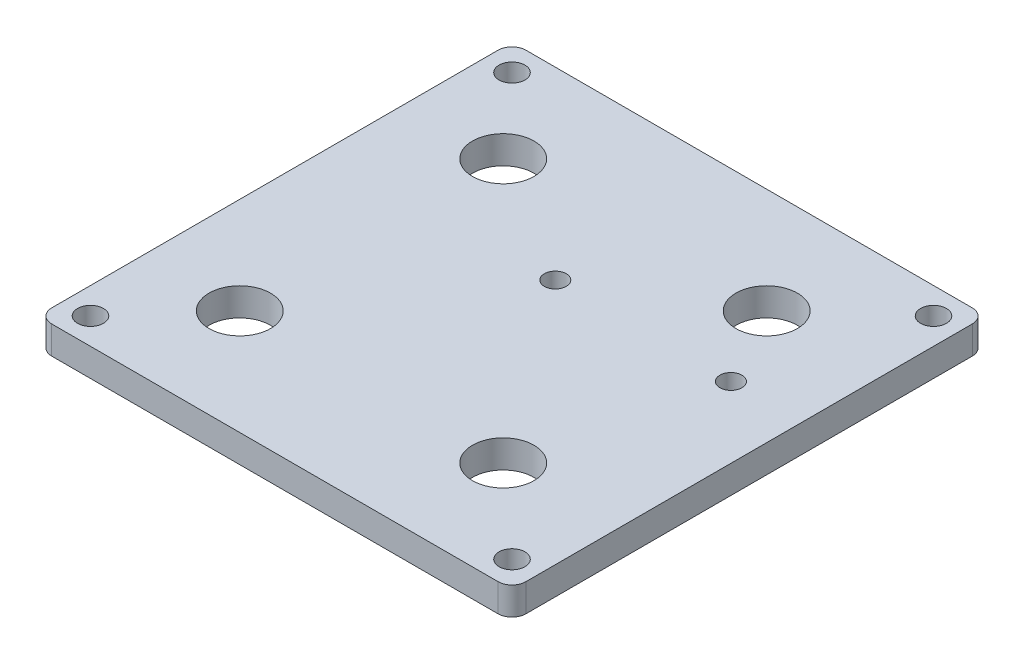
ISO-10303-21;
HEADER;
FILE_DESCRIPTION(('STEP AP214'),'2;1');
FILE_NAME('part.step','',(''),(''),'','','');
FILE_SCHEMA(('AUTOMOTIVE_DESIGN { 1 0 10303 214 1 1 1 1 }'));
ENDSEC;
DATA;
#1=APPLICATION_CONTEXT('core data for automotive mechanical design processes');
#2=APPLICATION_PROTOCOL_DEFINITION('international standard','automotive_design',2000,#1);
#3=PRODUCT_CONTEXT('',#1,'mechanical');
#4=PRODUCT('Part','Part','',(#3));
#5=PRODUCT_RELATED_PRODUCT_CATEGORY('part','',(#4));
#6=PRODUCT_DEFINITION_FORMATION('','',#4);
#7=PRODUCT_DEFINITION_CONTEXT('part definition',#1,'design');
#8=PRODUCT_DEFINITION('design','',#6,#7);
#9=PRODUCT_DEFINITION_SHAPE('','',#8);
#10=(LENGTH_UNIT() NAMED_UNIT(*) SI_UNIT(.MILLI.,.METRE.));
#11=(NAMED_UNIT(*) PLANE_ANGLE_UNIT() SI_UNIT($,.RADIAN.));
#12=(NAMED_UNIT(*) SI_UNIT($,.STERADIAN.) SOLID_ANGLE_UNIT());
#13=UNCERTAINTY_MEASURE_WITH_UNIT(LENGTH_MEASURE(1.E-05),#10,'distance_accuracy_value','');
#14=(GEOMETRIC_REPRESENTATION_CONTEXT(3) GLOBAL_UNCERTAINTY_ASSIGNED_CONTEXT((#13)) GLOBAL_UNIT_ASSIGNED_CONTEXT((#10,
#11,#12)) REPRESENTATION_CONTEXT('',''));
#15=CARTESIAN_POINT('',(0.,0.,0.));
#16=DIRECTION('',(0.,0.,1.));
#17=DIRECTION('',(1.,0.,0.));
#18=AXIS2_PLACEMENT_3D('',#15,#16,#17);
#19=CARTESIAN_POINT('',(0.,0.,0.));
#20=DIRECTION('',(0.,1.,0.));
#21=DIRECTION('',(0.,0.,1.));
#22=AXIS2_PLACEMENT_3D('',#19,#20,#21);
#23=PLANE('',#22);
#24=CARTESIAN_POINT('',(39.93,0.,16.));
#25=DIRECTION('',(0.,1.,0.));
#26=DIRECTION('',(0.,0.,1.));
#27=AXIS2_PLACEMENT_3D('',#24,#25,#26);
#28=CIRCLE('',#27,1.25);
#29=CARTESIAN_POINT('',(39.93,0.,17.25));
#30=VERTEX_POINT('',#29);
#31=EDGE_CURVE('E616',#30,#30,#28,.T.);
#32=ORIENTED_EDGE('',*,*,#31,.T.);
#33=EDGE_LOOP('',(#32));
#34=FACE_BOUND('',#33,.T.);
#35=CARTESIAN_POINT('',(19.93,0.,16.));
#36=DIRECTION('',(0.,1.,0.));
#37=DIRECTION('',(0.,0.,1.));
#38=AXIS2_PLACEMENT_3D('',#35,#36,#37);
#39=CIRCLE('',#38,1.25);
#40=CARTESIAN_POINT('',(19.93,0.,17.25));
#41=VERTEX_POINT('',#40);
#42=EDGE_CURVE('E305',#41,#41,#39,.T.);
#43=ORIENTED_EDGE('',*,*,#42,.T.);
#44=EDGE_LOOP('',(#43));
#45=FACE_BOUND('',#44,.T.);
#46=DIRECTION('',(1.,0.,0.));
#47=VECTOR('',#46,1.);
#48=CARTESIAN_POINT('',(0.,0.,-5.));
#49=LINE('',#48,#47);
#50=CARTESIAN_POINT('',(-4.41249999999999,0.,-5.));
#51=VERTEX_POINT('',#50);
#52=CARTESIAN_POINT('',(46.4125,0.,-5.));
#53=VERTEX_POINT('',#52);
#54=EDGE_CURVE('E146',#51,#53,#49,.T.);
#55=ORIENTED_EDGE('',*,*,#54,.T.);
#56=CARTESIAN_POINT('',(46.4125,0.,-3.4125));
#57=DIRECTION('',(0.,1.,0.));
#58=DIRECTION('',(0.,0.,1.));
#59=AXIS2_PLACEMENT_3D('',#56,#57,#58);
#60=CIRCLE('',#59,1.5875);
#61=CARTESIAN_POINT('',(48.,0.,-3.4125));
#62=VERTEX_POINT('',#61);
#63=EDGE_CURVE('E140',#53,#62,#60,.F.);
#64=ORIENTED_EDGE('',*,*,#63,.T.);
#65=DIRECTION('',(0.,0.,1.));
#66=VECTOR('',#65,1.);
#67=CARTESIAN_POINT('',(48.,0.,-5.00000000000001));
#68=LINE('',#67,#66);
#69=CARTESIAN_POINT('',(48.,0.,47.4125));
#70=VERTEX_POINT('',#69);
#71=EDGE_CURVE('E143',#62,#70,#68,.T.);
#72=ORIENTED_EDGE('',*,*,#71,.T.);
#73=CARTESIAN_POINT('',(46.4125,0.,47.4125));
#74=DIRECTION('',(0.,1.,0.));
#75=DIRECTION('',(0.,0.,1.));
#76=AXIS2_PLACEMENT_3D('',#73,#74,#75);
#77=CIRCLE('',#76,1.5875);
#78=CARTESIAN_POINT('',(46.4125,0.,49.));
#79=VERTEX_POINT('',#78);
#80=EDGE_CURVE('E152',#70,#79,#77,.F.);
#81=ORIENTED_EDGE('',*,*,#80,.T.);
#82=DIRECTION('',(1.,0.,0.));
#83=VECTOR('',#82,1.);
#84=CARTESIAN_POINT('',(0.,0.,49.));
#85=LINE('',#84,#83);
#86=CARTESIAN_POINT('',(-4.41249999999999,0.,49.));
#87=VERTEX_POINT('',#86);
#88=EDGE_CURVE('E213',#87,#79,#85,.T.);
#89=ORIENTED_EDGE('',*,*,#88,.F.);
#90=CARTESIAN_POINT('',(-4.41249999999999,0.,47.4125));
#91=DIRECTION('',(0.,1.,0.));
#92=DIRECTION('',(0.,0.,1.));
#93=AXIS2_PLACEMENT_3D('',#90,#91,#92);
#94=CIRCLE('',#93,1.5875);
#95=CARTESIAN_POINT('',(-5.99999999999999,0.,47.4125));
#96=VERTEX_POINT('',#95);
#97=EDGE_CURVE('E95',#87,#96,#94,.F.);
#98=ORIENTED_EDGE('',*,*,#97,.T.);
#99=DIRECTION('',(0.,0.,-1.));
#100=VECTOR('',#99,1.);
#101=CARTESIAN_POINT('',(-5.99999999999999,0.,-5.));
#102=LINE('',#101,#100);
#103=CARTESIAN_POINT('',(-5.99999999999999,0.,-3.4125));
#104=VERTEX_POINT('',#103);
#105=EDGE_CURVE('E309',#96,#104,#102,.T.);
#106=ORIENTED_EDGE('',*,*,#105,.T.);
#107=CARTESIAN_POINT('',(-4.41249999999999,0.,-3.4125));
#108=DIRECTION('',(0.,1.,0.));
#109=DIRECTION('',(0.,0.,1.));
#110=AXIS2_PLACEMENT_3D('',#107,#108,#109);
#111=CIRCLE('',#110,1.5875);
#112=EDGE_CURVE('E193',#104,#51,#111,.F.);
#113=ORIENTED_EDGE('',*,*,#112,.T.);
#114=EDGE_LOOP('',(#55,#64,#72,#81,#89,#98,#106,#113));
#115=FACE_BOUND('',#114,.T.);
#116=CARTESIAN_POINT('',(4.99999999999999,0.,7.));
#117=DIRECTION('',(0.,1.,0.));
#118=DIRECTION('',(0.,0.,1.));
#119=AXIS2_PLACEMENT_3D('',#116,#117,#118);
#120=CIRCLE('',#119,3.5);
#121=CARTESIAN_POINT('',(4.99999999999999,0.,10.5));
#122=VERTEX_POINT('',#121);
#123=EDGE_CURVE('E241',#122,#122,#120,.T.);
#124=ORIENTED_EDGE('',*,*,#123,.T.);
#125=EDGE_LOOP('',(#124));
#126=FACE_BOUND('',#125,.T.);
#127=CARTESIAN_POINT('',(35.,0.,7.));
#128=DIRECTION('',(0.,1.,0.));
#129=DIRECTION('',(0.,0.,1.));
#130=AXIS2_PLACEMENT_3D('',#127,#128,#129);
#131=CIRCLE('',#130,3.5);
#132=CARTESIAN_POINT('',(35.,0.,10.5));
#133=VERTEX_POINT('',#132);
#134=EDGE_CURVE('E237',#133,#133,#131,.T.);
#135=ORIENTED_EDGE('',*,*,#134,.T.);
#136=EDGE_LOOP('',(#135));
#137=FACE_BOUND('',#136,.T.);
#138=CARTESIAN_POINT('',(35.,0.,37.));
#139=DIRECTION('',(0.,1.,0.));
#140=DIRECTION('',(0.,0.,1.));
#141=AXIS2_PLACEMENT_3D('',#138,#139,#140);
#142=CIRCLE('',#141,3.5);
#143=CARTESIAN_POINT('',(35.,0.,40.5));
#144=VERTEX_POINT('',#143);
#145=EDGE_CURVE('E232',#144,#144,#142,.T.);
#146=ORIENTED_EDGE('',*,*,#145,.T.);
#147=EDGE_LOOP('',(#146));
#148=FACE_BOUND('',#147,.T.);
#149=CARTESIAN_POINT('',(5.,0.,37.));
#150=DIRECTION('',(0.,1.,0.));
#151=DIRECTION('',(0.,0.,1.));
#152=AXIS2_PLACEMENT_3D('',#149,#150,#151);
#153=CIRCLE('',#152,3.5);
#154=CARTESIAN_POINT('',(5.,0.,40.5));
#155=VERTEX_POINT('',#154);
#156=EDGE_CURVE('E228',#155,#155,#153,.T.);
#157=ORIENTED_EDGE('',*,*,#156,.T.);
#158=EDGE_LOOP('',(#157));
#159=FACE_BOUND('',#158,.T.);
#160=CARTESIAN_POINT('',(-2.99999999999999,0.,-2.));
#161=DIRECTION('',(0.,1.,0.));
#162=DIRECTION('',(0.,0.,1.));
#163=AXIS2_PLACEMENT_3D('',#160,#161,#162);
#164=CIRCLE('',#163,1.4732);
#165=CARTESIAN_POINT('',(-2.99999999999999,0.,-0.526800000000005));
#166=VERTEX_POINT('',#165);
#167=EDGE_CURVE('E259',#166,#166,#164,.F.);
#168=ORIENTED_EDGE('',*,*,#167,.F.);
#169=EDGE_LOOP('',(#168));
#170=FACE_BOUND('',#169,.T.);
#171=CARTESIAN_POINT('',(-3.,0.,46.));
#172=DIRECTION('',(0.,1.,0.));
#173=DIRECTION('',(0.,0.,1.));
#174=AXIS2_PLACEMENT_3D('',#171,#172,#173);
#175=CIRCLE('',#174,1.4732);
#176=CARTESIAN_POINT('',(-3.,0.,47.4732));
#177=VERTEX_POINT('',#176);
#178=EDGE_CURVE('E233',#177,#177,#175,.F.);
#179=ORIENTED_EDGE('',*,*,#178,.F.);
#180=EDGE_LOOP('',(#179));
#181=FACE_BOUND('',#180,.T.);
#182=CARTESIAN_POINT('',(45.,0.,-2.00000000000001));
#183=DIRECTION('',(0.,1.,0.));
#184=DIRECTION('',(0.,0.,1.));
#185=AXIS2_PLACEMENT_3D('',#182,#183,#184);
#186=CIRCLE('',#185,1.4732);
#187=CARTESIAN_POINT('',(45.,0.,-0.526800000000005));
#188=VERTEX_POINT('',#187);
#189=EDGE_CURVE('E164',#188,#188,#186,.F.);
#190=ORIENTED_EDGE('',*,*,#189,.F.);
#191=EDGE_LOOP('',(#190));
#192=FACE_BOUND('',#191,.T.);
#193=CARTESIAN_POINT('',(45.,0.,46.));
#194=DIRECTION('',(0.,1.,0.));
#195=DIRECTION('',(0.,0.,1.));
#196=AXIS2_PLACEMENT_3D('',#193,#194,#195);
#197=CIRCLE('',#196,1.4732);
#198=CARTESIAN_POINT('',(45.,0.,47.4732));
#199=VERTEX_POINT('',#198);
#200=EDGE_CURVE('E301',#199,#199,#197,.F.);
#201=ORIENTED_EDGE('',*,*,#200,.F.);
#202=EDGE_LOOP('',(#201));
#203=FACE_BOUND('',#202,.T.);
#204=ADVANCED_FACE('F73',(#34,#45,#115,#126,#137,#148,#159,#170,#181,#192,#203),#23,.F.);
#205=CARTESIAN_POINT('',(0.,3.175,-5.));
#206=DIRECTION('',(0.,0.,-1.));
#207=DIRECTION('',(-1.,0.,0.));
#208=AXIS2_PLACEMENT_3D('',#205,#206,#207);
#209=PLANE('',#208);
#210=DIRECTION('',(1.,0.,0.));
#211=VECTOR('',#210,1.);
#212=CARTESIAN_POINT('',(0.,3.175,-5.));
#213=LINE('',#212,#211);
#214=CARTESIAN_POINT('',(-4.41249999999999,3.175,-5.));
#215=VERTEX_POINT('',#214);
#216=CARTESIAN_POINT('',(46.4125,3.175,-5.));
#217=VERTEX_POINT('',#216);
#218=EDGE_CURVE('E220',#215,#217,#213,.T.);
#219=ORIENTED_EDGE('',*,*,#218,.T.);
#220=DIRECTION('',(0.,1.,0.));
#221=VECTOR('',#220,1.);
#222=CARTESIAN_POINT('',(46.4125,3.175,-5.));
#223=LINE('',#222,#221);
#224=EDGE_CURVE('E190',#217,#53,#223,.F.);
#225=ORIENTED_EDGE('',*,*,#224,.T.);
#226=ORIENTED_EDGE('',*,*,#54,.F.);
#227=DIRECTION('',(0.,1.,0.));
#228=VECTOR('',#227,1.);
#229=CARTESIAN_POINT('',(-4.41249999999999,3.175,-5.));
#230=LINE('',#229,#228);
#231=EDGE_CURVE('E186',#51,#215,#230,.T.);
#232=ORIENTED_EDGE('',*,*,#231,.T.);
#233=EDGE_LOOP('',(#219,#225,#226,#232));
#234=FACE_BOUND('',#233,.T.);
#235=ADVANCED_FACE('F273',(#234),#209,.T.);
#236=CARTESIAN_POINT('',(0.,3.175,0.));
#237=DIRECTION('',(0.,1.,0.));
#238=DIRECTION('',(0.,0.,1.));
#239=AXIS2_PLACEMENT_3D('',#236,#237,#238);
#240=PLANE('',#239);
#241=CARTESIAN_POINT('',(39.93,3.175,16.));
#242=DIRECTION('',(0.,1.,0.));
#243=DIRECTION('',(0.,0.,1.));
#244=AXIS2_PLACEMENT_3D('',#241,#242,#243);
#245=CIRCLE('',#244,1.25);
#246=CARTESIAN_POINT('',(39.93,3.175,17.25));
#247=VERTEX_POINT('',#246);
#248=EDGE_CURVE('E619',#247,#247,#245,.T.);
#249=ORIENTED_EDGE('',*,*,#248,.F.);
#250=EDGE_LOOP('',(#249));
#251=FACE_BOUND('',#250,.T.);
#252=CARTESIAN_POINT('',(19.93,3.175,16.));
#253=DIRECTION('',(0.,1.,0.));
#254=DIRECTION('',(0.,0.,1.));
#255=AXIS2_PLACEMENT_3D('',#252,#253,#254);
#256=CIRCLE('',#255,1.25);
#257=CARTESIAN_POINT('',(19.93,3.175,17.25));
#258=VERTEX_POINT('',#257);
#259=EDGE_CURVE('E612',#258,#258,#256,.T.);
#260=ORIENTED_EDGE('',*,*,#259,.F.);
#261=EDGE_LOOP('',(#260));
#262=FACE_BOUND('',#261,.T.);
#263=DIRECTION('',(0.,0.,-1.));
#264=VECTOR('',#263,1.);
#265=CARTESIAN_POINT('',(48.,3.175,-5.00000000000001));
#266=LINE('',#265,#264);
#267=CARTESIAN_POINT('',(48.,3.175,47.4125));
#268=VERTEX_POINT('',#267);
#269=CARTESIAN_POINT('',(48.,3.175,-3.4125));
#270=VERTEX_POINT('',#269);
#271=EDGE_CURVE('E163',#268,#270,#266,.T.);
#272=ORIENTED_EDGE('',*,*,#271,.T.);
#273=CARTESIAN_POINT('',(46.4125,3.175,-3.4125));
#274=DIRECTION('',(0.,1.,0.));
#275=DIRECTION('',(0.,0.,1.));
#276=AXIS2_PLACEMENT_3D('',#273,#274,#275);
#277=CIRCLE('',#276,1.5875);
#278=EDGE_CURVE('E167',#270,#217,#277,.T.);
#279=ORIENTED_EDGE('',*,*,#278,.T.);
#280=ORIENTED_EDGE('',*,*,#218,.F.);
#281=CARTESIAN_POINT('',(-4.41249999999999,3.175,-3.4125));
#282=DIRECTION('',(0.,1.,0.));
#283=DIRECTION('',(0.,0.,1.));
#284=AXIS2_PLACEMENT_3D('',#281,#282,#283);
#285=CIRCLE('',#284,1.5875);
#286=CARTESIAN_POINT('',(-5.99999999999999,3.175,-3.4125));
#287=VERTEX_POINT('',#286);
#288=EDGE_CURVE('E169',#215,#287,#285,.T.);
#289=ORIENTED_EDGE('',*,*,#288,.T.);
#290=DIRECTION('',(0.,0.,1.));
#291=VECTOR('',#290,1.);
#292=CARTESIAN_POINT('',(-5.99999999999999,3.175,-5.));
#293=LINE('',#292,#291);
#294=CARTESIAN_POINT('',(-5.99999999999999,3.175,47.4125));
#295=VERTEX_POINT('',#294);
#296=EDGE_CURVE('E312',#287,#295,#293,.T.);
#297=ORIENTED_EDGE('',*,*,#296,.T.);
#298=CARTESIAN_POINT('',(-4.41249999999999,3.175,47.4125));
#299=DIRECTION('',(0.,1.,0.));
#300=DIRECTION('',(0.,0.,1.));
#301=AXIS2_PLACEMENT_3D('',#298,#299,#300);
#302=CIRCLE('',#301,1.5875);
#303=CARTESIAN_POINT('',(-4.41249999999999,3.175,49.));
#304=VERTEX_POINT('',#303);
#305=EDGE_CURVE('E173',#295,#304,#302,.T.);
#306=ORIENTED_EDGE('',*,*,#305,.T.);
#307=DIRECTION('',(1.,0.,0.));
#308=VECTOR('',#307,1.);
#309=CARTESIAN_POINT('',(0.,3.175,49.));
#310=LINE('',#309,#308);
#311=CARTESIAN_POINT('',(46.4125,3.175,49.));
#312=VERTEX_POINT('',#311);
#313=EDGE_CURVE('E175',#304,#312,#310,.T.);
#314=ORIENTED_EDGE('',*,*,#313,.T.);
#315=CARTESIAN_POINT('',(46.4125,3.175,47.4125));
#316=DIRECTION('',(0.,1.,0.));
#317=DIRECTION('',(0.,0.,1.));
#318=AXIS2_PLACEMENT_3D('',#315,#316,#317);
#319=CIRCLE('',#318,1.5875);
#320=EDGE_CURVE('E181',#312,#268,#319,.T.);
#321=ORIENTED_EDGE('',*,*,#320,.T.);
#322=EDGE_LOOP('',(#272,#279,#280,#289,#297,#306,#314,#321));
#323=FACE_BOUND('',#322,.T.);
#324=CARTESIAN_POINT('',(5.,3.175,37.));
#325=DIRECTION('',(0.,1.,0.));
#326=DIRECTION('',(0.,0.,1.));
#327=AXIS2_PLACEMENT_3D('',#324,#325,#326);
#328=CIRCLE('',#327,3.5);
#329=CARTESIAN_POINT('',(5.,3.175,40.5));
#330=VERTEX_POINT('',#329);
#331=EDGE_CURVE('E247',#330,#330,#328,.T.);
#332=ORIENTED_EDGE('',*,*,#331,.F.);
#333=EDGE_LOOP('',(#332));
#334=FACE_BOUND('',#333,.T.);
#335=CARTESIAN_POINT('',(35.,3.175,37.));
#336=DIRECTION('',(0.,1.,0.));
#337=DIRECTION('',(0.,0.,1.));
#338=AXIS2_PLACEMENT_3D('',#335,#336,#337);
#339=CIRCLE('',#338,3.5);
#340=CARTESIAN_POINT('',(35.,3.175,40.5));
#341=VERTEX_POINT('',#340);
#342=EDGE_CURVE('E250',#341,#341,#339,.T.);
#343=ORIENTED_EDGE('',*,*,#342,.F.);
#344=EDGE_LOOP('',(#343));
#345=FACE_BOUND('',#344,.T.);
#346=CARTESIAN_POINT('',(35.,3.175,7.));
#347=DIRECTION('',(0.,1.,0.));
#348=DIRECTION('',(0.,0.,1.));
#349=AXIS2_PLACEMENT_3D('',#346,#347,#348);
#350=CIRCLE('',#349,3.5);
#351=CARTESIAN_POINT('',(35.,3.175,10.5));
#352=VERTEX_POINT('',#351);
#353=EDGE_CURVE('E256',#352,#352,#350,.T.);
#354=ORIENTED_EDGE('',*,*,#353,.F.);
#355=EDGE_LOOP('',(#354));
#356=FACE_BOUND('',#355,.T.);
#357=CARTESIAN_POINT('',(4.99999999999999,3.175,7.));
#358=DIRECTION('',(0.,1.,0.));
#359=DIRECTION('',(0.,0.,1.));
#360=AXIS2_PLACEMENT_3D('',#357,#358,#359);
#361=CIRCLE('',#360,3.5);
#362=CARTESIAN_POINT('',(4.99999999999999,3.175,10.5));
#363=VERTEX_POINT('',#362);
#364=EDGE_CURVE('E224',#363,#363,#361,.T.);
#365=ORIENTED_EDGE('',*,*,#364,.F.);
#366=EDGE_LOOP('',(#365));
#367=FACE_BOUND('',#366,.T.);
#368=CARTESIAN_POINT('',(-2.99999999999999,3.175,-2.));
#369=DIRECTION('',(0.,1.,0.));
#370=DIRECTION('',(0.,0.,1.));
#371=AXIS2_PLACEMENT_3D('',#368,#369,#370);
#372=CIRCLE('',#371,1.4732);
#373=CARTESIAN_POINT('',(-2.99999999999999,3.175,-0.526800000000005));
#374=VERTEX_POINT('',#373);
#375=EDGE_CURVE('E280',#374,#374,#372,.T.);
#376=ORIENTED_EDGE('',*,*,#375,.F.);
#377=EDGE_LOOP('',(#376));
#378=FACE_BOUND('',#377,.T.);
#379=CARTESIAN_POINT('',(-3.,3.175,46.));
#380=DIRECTION('',(0.,1.,0.));
#381=DIRECTION('',(0.,0.,1.));
#382=AXIS2_PLACEMENT_3D('',#379,#380,#381);
#383=CIRCLE('',#382,1.4732);
#384=CARTESIAN_POINT('',(-3.,3.175,47.4732));
#385=VERTEX_POINT('',#384);
#386=EDGE_CURVE('E284',#385,#385,#383,.T.);
#387=ORIENTED_EDGE('',*,*,#386,.F.);
#388=EDGE_LOOP('',(#387));
#389=FACE_BOUND('',#388,.T.);
#390=CARTESIAN_POINT('',(45.,3.175,-2.00000000000001));
#391=DIRECTION('',(0.,1.,0.));
#392=DIRECTION('',(0.,0.,1.));
#393=AXIS2_PLACEMENT_3D('',#390,#391,#392);
#394=CIRCLE('',#393,1.4732);
#395=CARTESIAN_POINT('',(45.,3.175,-0.526800000000005));
#396=VERTEX_POINT('',#395);
#397=EDGE_CURVE('E288',#396,#396,#394,.T.);
#398=ORIENTED_EDGE('',*,*,#397,.F.);
#399=EDGE_LOOP('',(#398));
#400=FACE_BOUND('',#399,.T.);
#401=CARTESIAN_POINT('',(45.,3.175,46.));
#402=DIRECTION('',(0.,1.,0.));
#403=DIRECTION('',(0.,0.,1.));
#404=AXIS2_PLACEMENT_3D('',#401,#402,#403);
#405=CIRCLE('',#404,1.4732);
#406=CARTESIAN_POINT('',(45.,3.175,47.4732));
#407=VERTEX_POINT('',#406);
#408=EDGE_CURVE('E291',#407,#407,#405,.T.);
#409=ORIENTED_EDGE('',*,*,#408,.F.);
#410=EDGE_LOOP('',(#409));
#411=FACE_BOUND('',#410,.T.);
#412=ADVANCED_FACE('F216',(#251,#262,#323,#334,#345,#356,#367,#378,#389,#400,#411),#240,.T.);
#413=CARTESIAN_POINT('',(0.,3.175,49.));
#414=DIRECTION('',(0.,0.,-1.));
#415=DIRECTION('',(-1.,0.,0.));
#416=AXIS2_PLACEMENT_3D('',#413,#414,#415);
#417=PLANE('',#416);
#418=ORIENTED_EDGE('',*,*,#88,.T.);
#419=DIRECTION('',(0.,1.,0.));
#420=VECTOR('',#419,1.);
#421=CARTESIAN_POINT('',(46.4125,3.175,49.));
#422=LINE('',#421,#420);
#423=EDGE_CURVE('E202',#79,#312,#422,.T.);
#424=ORIENTED_EDGE('',*,*,#423,.T.);
#425=ORIENTED_EDGE('',*,*,#313,.F.);
#426=DIRECTION('',(0.,1.,0.));
#427=VECTOR('',#426,1.);
#428=CARTESIAN_POINT('',(-4.41249999999999,0.,49.));
#429=LINE('',#428,#427);
#430=EDGE_CURVE('E151',#304,#87,#429,.F.);
#431=ORIENTED_EDGE('',*,*,#430,.T.);
#432=EDGE_LOOP('',(#418,#424,#425,#431));
#433=FACE_BOUND('',#432,.T.);
#434=ADVANCED_FACE('F211',(#433),#417,.F.);
#435=CARTESIAN_POINT('',(5.,3.175,37.));
#436=DIRECTION('',(0.,-1.,0.));
#437=DIRECTION('',(0.,0.,-1.));
#438=AXIS2_PLACEMENT_3D('',#435,#436,#437);
#439=CYLINDRICAL_SURFACE('',#438,3.5);
#440=ORIENTED_EDGE('',*,*,#331,.T.);
#441=EDGE_LOOP('',(#440));
#442=FACE_BOUND('',#441,.T.);
#443=ORIENTED_EDGE('',*,*,#156,.F.);
#444=EDGE_LOOP('',(#443));
#445=FACE_BOUND('',#444,.T.);
#446=ADVANCED_FACE('F343',(#442,#445),#439,.F.);
#447=CARTESIAN_POINT('',(35.,3.175,37.));
#448=DIRECTION('',(0.,-1.,0.));
#449=DIRECTION('',(0.,0.,-1.));
#450=AXIS2_PLACEMENT_3D('',#447,#448,#449);
#451=CYLINDRICAL_SURFACE('',#450,3.5);
#452=ORIENTED_EDGE('',*,*,#342,.T.);
#453=EDGE_LOOP('',(#452));
#454=FACE_BOUND('',#453,.T.);
#455=ORIENTED_EDGE('',*,*,#145,.F.);
#456=EDGE_LOOP('',(#455));
#457=FACE_BOUND('',#456,.T.);
#458=ADVANCED_FACE('F347',(#454,#457),#451,.F.);
#459=CARTESIAN_POINT('',(35.,3.175,7.));
#460=DIRECTION('',(0.,-1.,0.));
#461=DIRECTION('',(0.,0.,-1.));
#462=AXIS2_PLACEMENT_3D('',#459,#460,#461);
#463=CYLINDRICAL_SURFACE('',#462,3.5);
#464=ORIENTED_EDGE('',*,*,#353,.T.);
#465=EDGE_LOOP('',(#464));
#466=FACE_BOUND('',#465,.T.);
#467=ORIENTED_EDGE('',*,*,#134,.F.);
#468=EDGE_LOOP('',(#467));
#469=FACE_BOUND('',#468,.T.);
#470=ADVANCED_FACE('F352',(#466,#469),#463,.F.);
#471=CARTESIAN_POINT('',(4.99999999999999,3.175,7.));
#472=DIRECTION('',(0.,-1.,0.));
#473=DIRECTION('',(0.,0.,-1.));
#474=AXIS2_PLACEMENT_3D('',#471,#472,#473);
#475=CYLINDRICAL_SURFACE('',#474,3.5);
#476=ORIENTED_EDGE('',*,*,#364,.T.);
#477=EDGE_LOOP('',(#476));
#478=FACE_BOUND('',#477,.T.);
#479=ORIENTED_EDGE('',*,*,#123,.F.);
#480=EDGE_LOOP('',(#479));
#481=FACE_BOUND('',#480,.T.);
#482=ADVANCED_FACE('F268',(#478,#481),#475,.F.);
#483=CARTESIAN_POINT('',(-5.99999999999999,-54.3323108288245,-5.));
#484=DIRECTION('',(-1.,0.,0.));
#485=DIRECTION('',(0.,0.,1.));
#486=AXIS2_PLACEMENT_3D('',#483,#484,#485);
#487=PLANE('',#486);
#488=ORIENTED_EDGE('',*,*,#105,.F.);
#489=DIRECTION('',(0.,1.,0.));
#490=VECTOR('',#489,1.);
#491=CARTESIAN_POINT('',(-5.99999999999999,3.175,47.4125));
#492=LINE('',#491,#490);
#493=EDGE_CURVE('E12',#96,#295,#492,.T.);
#494=ORIENTED_EDGE('',*,*,#493,.T.);
#495=ORIENTED_EDGE('',*,*,#296,.F.);
#496=DIRECTION('',(0.,1.,0.));
#497=VECTOR('',#496,1.);
#498=CARTESIAN_POINT('',(-5.99999999999999,-54.3323108288245,-3.4125));
#499=LINE('',#498,#497);
#500=EDGE_CURVE('E82',#287,#104,#499,.F.);
#501=ORIENTED_EDGE('',*,*,#500,.T.);
#502=EDGE_LOOP('',(#488,#494,#495,#501));
#503=FACE_BOUND('',#502,.T.);
#504=ADVANCED_FACE('F276',(#503),#487,.T.);
#505=CARTESIAN_POINT('',(-3.,-54.3323108288245,46.));
#506=DIRECTION('',(0.,1.,0.));
#507=DIRECTION('',(0.,0.,1.));
#508=AXIS2_PLACEMENT_3D('',#505,#506,#507);
#509=CYLINDRICAL_SURFACE('',#508,1.4732);
#510=ORIENTED_EDGE('',*,*,#178,.T.);
#511=EDGE_LOOP('',(#510));
#512=FACE_BOUND('',#511,.T.);
#513=ORIENTED_EDGE('',*,*,#386,.T.);
#514=EDGE_LOOP('',(#513));
#515=FACE_BOUND('',#514,.T.);
#516=ADVANCED_FACE('F388',(#512,#515),#509,.F.);
#517=CARTESIAN_POINT('',(-2.99999999999999,-54.3323108288245,-2.));
#518=DIRECTION('',(0.,1.,0.));
#519=DIRECTION('',(0.,0.,1.));
#520=AXIS2_PLACEMENT_3D('',#517,#518,#519);
#521=CYLINDRICAL_SURFACE('',#520,1.4732);
#522=ORIENTED_EDGE('',*,*,#167,.T.);
#523=EDGE_LOOP('',(#522));
#524=FACE_BOUND('',#523,.T.);
#525=ORIENTED_EDGE('',*,*,#375,.T.);
#526=EDGE_LOOP('',(#525));
#527=FACE_BOUND('',#526,.T.);
#528=ADVANCED_FACE('F379',(#524,#527),#521,.F.);
#529=CARTESIAN_POINT('',(48.,-54.3323108288245,-5.00000000000001));
#530=DIRECTION('',(1.,0.,0.));
#531=DIRECTION('',(0.,0.,-1.));
#532=AXIS2_PLACEMENT_3D('',#529,#530,#531);
#533=PLANE('',#532);
#534=ORIENTED_EDGE('',*,*,#71,.F.);
#535=DIRECTION('',(0.,1.,0.));
#536=VECTOR('',#535,1.);
#537=CARTESIAN_POINT('',(48.,-54.3323108288245,-3.4125));
#538=LINE('',#537,#536);
#539=EDGE_CURVE('E158',#62,#270,#538,.T.);
#540=ORIENTED_EDGE('',*,*,#539,.T.);
#541=ORIENTED_EDGE('',*,*,#271,.F.);
#542=DIRECTION('',(0.,1.,0.));
#543=VECTOR('',#542,1.);
#544=CARTESIAN_POINT('',(48.,0.,47.4125));
#545=LINE('',#544,#543);
#546=EDGE_CURVE('E161',#268,#70,#545,.F.);
#547=ORIENTED_EDGE('',*,*,#546,.T.);
#548=EDGE_LOOP('',(#534,#540,#541,#547));
#549=FACE_BOUND('',#548,.T.);
#550=ADVANCED_FACE('F156',(#549),#533,.T.);
#551=CARTESIAN_POINT('',(45.,-54.3323108288245,46.));
#552=DIRECTION('',(0.,1.,0.));
#553=DIRECTION('',(0.,0.,1.));
#554=AXIS2_PLACEMENT_3D('',#551,#552,#553);
#555=CYLINDRICAL_SURFACE('',#554,1.4732);
#556=ORIENTED_EDGE('',*,*,#200,.T.);
#557=EDGE_LOOP('',(#556));
#558=FACE_BOUND('',#557,.T.);
#559=ORIENTED_EDGE('',*,*,#408,.T.);
#560=EDGE_LOOP('',(#559));
#561=FACE_BOUND('',#560,.T.);
#562=ADVANCED_FACE('F378',(#558,#561),#555,.F.);
#563=CARTESIAN_POINT('',(45.,-54.3323108288245,-2.00000000000001));
#564=DIRECTION('',(0.,1.,0.));
#565=DIRECTION('',(0.,0.,1.));
#566=AXIS2_PLACEMENT_3D('',#563,#564,#565);
#567=CYLINDRICAL_SURFACE('',#566,1.4732);
#568=ORIENTED_EDGE('',*,*,#189,.T.);
#569=EDGE_LOOP('',(#568));
#570=FACE_BOUND('',#569,.T.);
#571=ORIENTED_EDGE('',*,*,#397,.T.);
#572=EDGE_LOOP('',(#571));
#573=FACE_BOUND('',#572,.T.);
#574=ADVANCED_FACE('F370',(#570,#573),#567,.F.);
#575=CARTESIAN_POINT('',(19.93,3.175,16.));
#576=DIRECTION('',(0.,1.,0.));
#577=DIRECTION('',(0.,0.,1.));
#578=AXIS2_PLACEMENT_3D('',#575,#576,#577);
#579=CYLINDRICAL_SURFACE('',#578,1.25);
#580=ORIENTED_EDGE('',*,*,#42,.F.);
#581=EDGE_LOOP('',(#580));
#582=FACE_BOUND('',#581,.T.);
#583=ORIENTED_EDGE('',*,*,#259,.T.);
#584=EDGE_LOOP('',(#583));
#585=FACE_BOUND('',#584,.T.);
#586=ADVANCED_FACE('F364',(#582,#585),#579,.F.);
#587=CARTESIAN_POINT('',(39.93,3.175,16.));
#588=DIRECTION('',(0.,1.,0.));
#589=DIRECTION('',(0.,0.,1.));
#590=AXIS2_PLACEMENT_3D('',#587,#588,#589);
#591=CYLINDRICAL_SURFACE('',#590,1.25);
#592=ORIENTED_EDGE('',*,*,#31,.F.);
#593=EDGE_LOOP('',(#592));
#594=FACE_BOUND('',#593,.T.);
#595=ORIENTED_EDGE('',*,*,#248,.T.);
#596=EDGE_LOOP('',(#595));
#597=FACE_BOUND('',#596,.T.);
#598=ADVANCED_FACE('F360',(#594,#597),#591,.F.);
#599=CARTESIAN_POINT('',(46.4125,-54.3323108288245,-3.4125));
#600=DIRECTION('',(0.,1.,0.));
#601=DIRECTION('',(0.,0.,1.));
#602=AXIS2_PLACEMENT_3D('',#599,#600,#601);
#603=CYLINDRICAL_SURFACE('',#602,1.5875);
#604=ORIENTED_EDGE('',*,*,#63,.F.);
#605=ORIENTED_EDGE('',*,*,#224,.F.);
#606=ORIENTED_EDGE('',*,*,#278,.F.);
#607=ORIENTED_EDGE('',*,*,#539,.F.);
#608=EDGE_LOOP('',(#604,#605,#606,#607));
#609=FACE_BOUND('',#608,.T.);
#610=ADVANCED_FACE('F166',(#609),#603,.T.);
#611=CARTESIAN_POINT('',(46.4125,3.175,47.4125));
#612=DIRECTION('',(0.,-1.,0.));
#613=DIRECTION('',(0.,0.,-1.));
#614=AXIS2_PLACEMENT_3D('',#611,#612,#613);
#615=CYLINDRICAL_SURFACE('',#614,1.5875);
#616=ORIENTED_EDGE('',*,*,#80,.F.);
#617=ORIENTED_EDGE('',*,*,#546,.F.);
#618=ORIENTED_EDGE('',*,*,#320,.F.);
#619=ORIENTED_EDGE('',*,*,#423,.F.);
#620=EDGE_LOOP('',(#616,#617,#618,#619));
#621=FACE_BOUND('',#620,.T.);
#622=ADVANCED_FACE('F323',(#621),#615,.T.);
#623=CARTESIAN_POINT('',(-4.41249999999999,-54.3323108288245,47.4125));
#624=DIRECTION('',(0.,-1.,0.));
#625=DIRECTION('',(0.,0.,-1.));
#626=AXIS2_PLACEMENT_3D('',#623,#624,#625);
#627=CYLINDRICAL_SURFACE('',#626,1.5875);
#628=ORIENTED_EDGE('',*,*,#97,.F.);
#629=ORIENTED_EDGE('',*,*,#430,.F.);
#630=ORIENTED_EDGE('',*,*,#305,.F.);
#631=ORIENTED_EDGE('',*,*,#493,.F.);
#632=EDGE_LOOP('',(#628,#629,#630,#631));
#633=FACE_BOUND('',#632,.T.);
#634=ADVANCED_FACE('F325',(#633),#627,.T.);
#635=CARTESIAN_POINT('',(-4.41249999999999,3.175,-3.4125));
#636=DIRECTION('',(0.,1.,0.));
#637=DIRECTION('',(0.,0.,1.));
#638=AXIS2_PLACEMENT_3D('',#635,#636,#637);
#639=CYLINDRICAL_SURFACE('',#638,1.5875);
#640=ORIENTED_EDGE('',*,*,#112,.F.);
#641=ORIENTED_EDGE('',*,*,#500,.F.);
#642=ORIENTED_EDGE('',*,*,#288,.F.);
#643=ORIENTED_EDGE('',*,*,#231,.F.);
#644=EDGE_LOOP('',(#640,#641,#642,#643));
#645=FACE_BOUND('',#644,.T.);
#646=ADVANCED_FACE('F75',(#645),#639,.T.);
#647=CLOSED_SHELL('',(#204,#235,#412,#434,#446,#458,#470,#482,#504,#516,#528,#550,#562,#574,
#586,#598,#610,#622,#634,#646));
#648=MANIFOLD_SOLID_BREP('B2',#647);
#649=ADVANCED_BREP_SHAPE_REPRESENTATION('',(#18,#648),#14);
#650=SHAPE_DEFINITION_REPRESENTATION(#9,#649);
ENDSEC;
END-ISO-10303-21;
